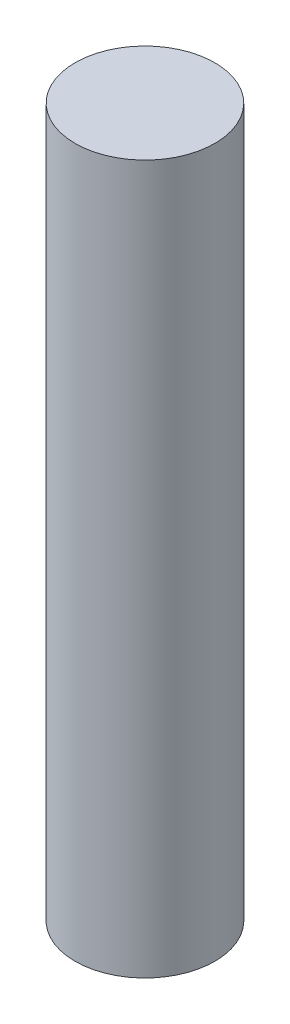
ISO-10303-21;
HEADER;
FILE_DESCRIPTION(('STEP AP214'),'2;1');
FILE_NAME('part.step','',(''),(''),'','','');
FILE_SCHEMA(('AUTOMOTIVE_DESIGN { 1 0 10303 214 1 1 1 1 }'));
ENDSEC;
DATA;
#1=APPLICATION_CONTEXT('core data for automotive mechanical design processes');
#2=APPLICATION_PROTOCOL_DEFINITION('international standard','automotive_design',2000,#1);
#3=PRODUCT_CONTEXT('',#1,'mechanical');
#4=PRODUCT('Part','Part','',(#3));
#5=PRODUCT_RELATED_PRODUCT_CATEGORY('part','',(#4));
#6=PRODUCT_DEFINITION_FORMATION('','',#4);
#7=PRODUCT_DEFINITION_CONTEXT('part definition',#1,'design');
#8=PRODUCT_DEFINITION('design','',#6,#7);
#9=PRODUCT_DEFINITION_SHAPE('','',#8);
#10=(LENGTH_UNIT() NAMED_UNIT(*) SI_UNIT(.MILLI.,.METRE.));
#11=(NAMED_UNIT(*) PLANE_ANGLE_UNIT() SI_UNIT($,.RADIAN.));
#12=(NAMED_UNIT(*) SI_UNIT($,.STERADIAN.) SOLID_ANGLE_UNIT());
#13=UNCERTAINTY_MEASURE_WITH_UNIT(LENGTH_MEASURE(1.E-05),#10,'distance_accuracy_value','');
#14=(GEOMETRIC_REPRESENTATION_CONTEXT(3) GLOBAL_UNCERTAINTY_ASSIGNED_CONTEXT((#13)) GLOBAL_UNIT_ASSIGNED_CONTEXT((#10,
#11,#12)) REPRESENTATION_CONTEXT('',''));
#15=CARTESIAN_POINT('',(0.,0.,0.));
#16=DIRECTION('',(0.,0.,1.));
#17=DIRECTION('',(1.,0.,0.));
#18=AXIS2_PLACEMENT_3D('',#15,#16,#17);
#19=CARTESIAN_POINT('',(0.,150.,0.));
#20=DIRECTION('',(0.,-1.,0.));
#21=DIRECTION('',(0.,0.,-1.));
#22=AXIS2_PLACEMENT_3D('',#19,#20,#21);
#23=CYLINDRICAL_SURFACE('',#22,14.8);
#24=CARTESIAN_POINT('',(0.,150.,0.));
#25=DIRECTION('',(0.,1.,0.));
#26=DIRECTION('',(0.,0.,1.));
#27=AXIS2_PLACEMENT_3D('',#24,#25,#26);
#28=CIRCLE('',#27,14.8);
#29=CARTESIAN_POINT('',(0.,150.,14.8));
#30=VERTEX_POINT('',#29);
#31=EDGE_CURVE('E10',#30,#30,#28,.T.);
#32=ORIENTED_EDGE('',*,*,#31,.F.);
#33=EDGE_LOOP('',(#32));
#34=FACE_BOUND('',#33,.T.);
#35=CARTESIAN_POINT('',(0.,0.,0.));
#36=DIRECTION('',(0.,1.,0.));
#37=DIRECTION('',(0.,0.,1.));
#38=AXIS2_PLACEMENT_3D('',#35,#36,#37);
#39=CIRCLE('',#38,14.8);
#40=CARTESIAN_POINT('',(0.,0.,14.8));
#41=VERTEX_POINT('',#40);
#42=EDGE_CURVE('E40',#41,#41,#39,.T.);
#43=ORIENTED_EDGE('',*,*,#42,.T.);
#44=EDGE_LOOP('',(#43));
#45=FACE_BOUND('',#44,.T.);
#46=ADVANCED_FACE('F37',(#34,#45),#23,.T.);
#47=CARTESIAN_POINT('',(0.,150.,0.));
#48=DIRECTION('',(0.,1.,0.));
#49=DIRECTION('',(0.,0.,1.));
#50=AXIS2_PLACEMENT_3D('',#47,#48,#49);
#51=PLANE('',#50);
#52=ORIENTED_EDGE('',*,*,#31,.T.);
#53=EDGE_LOOP('',(#52));
#54=FACE_BOUND('',#53,.T.);
#55=ADVANCED_FACE('F52',(#54),#51,.T.);
#56=CARTESIAN_POINT('',(0.,0.,0.));
#57=DIRECTION('',(0.,1.,0.));
#58=DIRECTION('',(0.,0.,1.));
#59=AXIS2_PLACEMENT_3D('',#56,#57,#58);
#60=PLANE('',#59);
#61=ORIENTED_EDGE('',*,*,#42,.F.);
#62=EDGE_LOOP('',(#61));
#63=FACE_BOUND('',#62,.T.);
#64=ADVANCED_FACE('F50',(#63),#60,.F.);
#65=CLOSED_SHELL('',(#46,#55,#64));
#66=MANIFOLD_SOLID_BREP('B2',#65);
#67=ADVANCED_BREP_SHAPE_REPRESENTATION('',(#18,#66),#14);
#68=SHAPE_DEFINITION_REPRESENTATION(#9,#67);
ENDSEC;
END-ISO-10303-21;
